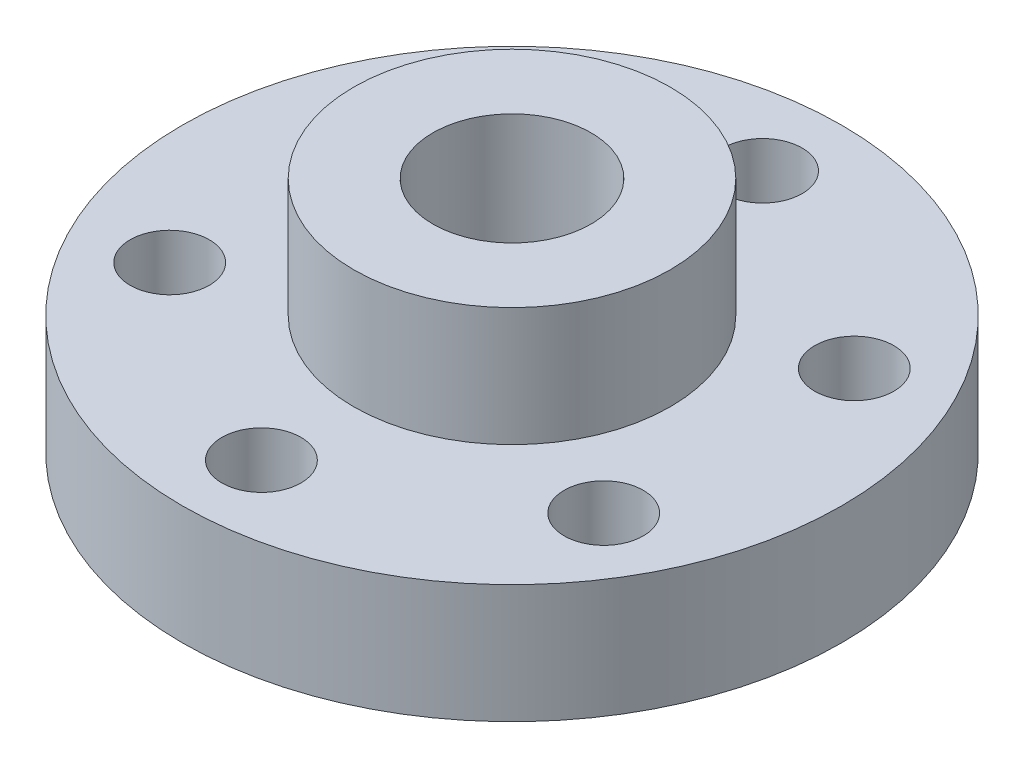
ISO-10303-21;
HEADER;
FILE_DESCRIPTION(('STEP AP214'),'2;1');
FILE_NAME('part.step','',(''),(''),'','','');
FILE_SCHEMA(('AUTOMOTIVE_DESIGN { 1 0 10303 214 1 1 1 1 }'));
ENDSEC;
DATA;
#1=APPLICATION_CONTEXT('core data for automotive mechanical design processes');
#2=APPLICATION_PROTOCOL_DEFINITION('international standard','automotive_design',2000,#1);
#3=PRODUCT_CONTEXT('',#1,'mechanical');
#4=PRODUCT('Part','Part','',(#3));
#5=PRODUCT_RELATED_PRODUCT_CATEGORY('part','',(#4));
#6=PRODUCT_DEFINITION_FORMATION('','',#4);
#7=PRODUCT_DEFINITION_CONTEXT('part definition',#1,'design');
#8=PRODUCT_DEFINITION('design','',#6,#7);
#9=PRODUCT_DEFINITION_SHAPE('','',#8);
#10=(LENGTH_UNIT() NAMED_UNIT(*) SI_UNIT(.MILLI.,.METRE.));
#11=(NAMED_UNIT(*) PLANE_ANGLE_UNIT() SI_UNIT($,.RADIAN.));
#12=(NAMED_UNIT(*) SI_UNIT($,.STERADIAN.) SOLID_ANGLE_UNIT());
#13=UNCERTAINTY_MEASURE_WITH_UNIT(LENGTH_MEASURE(1.E-05),#10,'distance_accuracy_value','');
#14=(GEOMETRIC_REPRESENTATION_CONTEXT(3) GLOBAL_UNCERTAINTY_ASSIGNED_CONTEXT((#13)) GLOBAL_UNIT_ASSIGNED_CONTEXT((#10,
#11,#12)) REPRESENTATION_CONTEXT('',''));
#15=CARTESIAN_POINT('',(0.,0.,0.));
#16=DIRECTION('',(0.,0.,1.));
#17=DIRECTION('',(1.,0.,0.));
#18=AXIS2_PLACEMENT_3D('',#15,#16,#17);
#19=CARTESIAN_POINT('',(0.,4.5,0.));
#20=DIRECTION('',(0.,1.,0.));
#21=DIRECTION('',(0.,0.,1.));
#22=AXIS2_PLACEMENT_3D('',#19,#20,#21);
#23=PLANE('',#22);
#24=CARTESIAN_POINT('',(0.,4.5,0.));
#25=DIRECTION('',(0.,1.,0.));
#26=DIRECTION('',(0.,0.,1.));
#27=AXIS2_PLACEMENT_3D('',#24,#25,#26);
#28=CIRCLE('',#27,12.5);
#29=CARTESIAN_POINT('',(0.,4.5,12.5));
#30=VERTEX_POINT('',#29);
#31=EDGE_CURVE('E11',#30,#30,#28,.T.);
#32=ORIENTED_EDGE('',*,*,#31,.T.);
#33=EDGE_LOOP('',(#32));
#34=FACE_BOUND('',#33,.T.);
#35=CARTESIAN_POINT('',(0.,4.5,-9.5));
#36=DIRECTION('',(0.,1.,0.));
#37=DIRECTION('',(0.,0.,1.));
#38=AXIS2_PLACEMENT_3D('',#35,#36,#37);
#39=CIRCLE('',#38,1.5);
#40=CARTESIAN_POINT('',(0.,4.5,-8.));
#41=VERTEX_POINT('',#40);
#42=EDGE_CURVE('E54',#41,#41,#39,.T.);
#43=ORIENTED_EDGE('',*,*,#42,.F.);
#44=EDGE_LOOP('',(#43));
#45=FACE_BOUND('',#44,.T.);
#46=CARTESIAN_POINT('',(8.22724133595243,4.5,-4.75000000000047));
#47=DIRECTION('',(0.,1.,0.));
#48=DIRECTION('',(0.,0.,1.));
#49=AXIS2_PLACEMENT_3D('',#46,#47,#48);
#50=CIRCLE('',#49,1.50000000000014);
#51=CARTESIAN_POINT('',(8.22724133595243,4.5,-3.25000000000032));
#52=VERTEX_POINT('',#51);
#53=EDGE_CURVE('E60',#52,#52,#50,.T.);
#54=ORIENTED_EDGE('',*,*,#53,.F.);
#55=EDGE_LOOP('',(#54));
#56=FACE_BOUND('',#55,.T.);
#57=CARTESIAN_POINT('',(8.22724133595298,4.5,4.74999999999953));
#58=DIRECTION('',(0.,1.,0.));
#59=DIRECTION('',(0.,0.,1.));
#60=AXIS2_PLACEMENT_3D('',#57,#58,#59);
#61=CIRCLE('',#60,1.50000000000068);
#62=CARTESIAN_POINT('',(8.22724133595298,4.5,6.25000000000021));
#63=VERTEX_POINT('',#62);
#64=EDGE_CURVE('E115',#63,#63,#61,.T.);
#65=ORIENTED_EDGE('',*,*,#64,.F.);
#66=EDGE_LOOP('',(#65));
#67=FACE_BOUND('',#66,.T.);
#68=CARTESIAN_POINT('',(1.07769812943697E-12,4.5,9.5));
#69=DIRECTION('',(0.,1.,0.));
#70=DIRECTION('',(0.,0.,1.));
#71=AXIS2_PLACEMENT_3D('',#68,#69,#70);
#72=CIRCLE('',#71,1.50000000000109);
#73=CARTESIAN_POINT('',(1.07769812943697E-12,4.5,11.0000000000011));
#74=VERTEX_POINT('',#73);
#75=EDGE_CURVE('E106',#74,#74,#72,.T.);
#76=ORIENTED_EDGE('',*,*,#75,.F.);
#77=EDGE_LOOP('',(#76));
#78=FACE_BOUND('',#77,.T.);
#79=CARTESIAN_POINT('',(-8.22724133595136,4.5,4.75000000000047));
#80=DIRECTION('',(0.,1.,0.));
#81=DIRECTION('',(0.,0.,1.));
#82=AXIS2_PLACEMENT_3D('',#79,#80,#81);
#83=CIRCLE('',#82,1.50000000000099);
#84=CARTESIAN_POINT('',(-8.22724133595136,4.5,6.25000000000146));
#85=VERTEX_POINT('',#84);
#86=EDGE_CURVE('E100',#85,#85,#83,.T.);
#87=ORIENTED_EDGE('',*,*,#86,.F.);
#88=EDGE_LOOP('',(#87));
#89=FACE_BOUND('',#88,.T.);
#90=CARTESIAN_POINT('',(-8.2272413359519,4.5,-4.74999999999953));
#91=DIRECTION('',(0.,1.,0.));
#92=DIRECTION('',(0.,0.,1.));
#93=AXIS2_PLACEMENT_3D('',#90,#91,#92);
#94=CIRCLE('',#93,1.50000000000051);
#95=CARTESIAN_POINT('',(-8.2272413359519,4.5,-3.24999999999902));
#96=VERTEX_POINT('',#95);
#97=EDGE_CURVE('E95',#96,#96,#94,.T.);
#98=ORIENTED_EDGE('',*,*,#97,.F.);
#99=EDGE_LOOP('',(#98));
#100=FACE_BOUND('',#99,.T.);
#101=CARTESIAN_POINT('',(0.,4.5,0.));
#102=DIRECTION('',(0.,1.,0.));
#103=DIRECTION('',(0.,0.,1.));
#104=AXIS2_PLACEMENT_3D('',#101,#102,#103);
#105=CIRCLE('',#104,6.);
#106=CARTESIAN_POINT('',(0.,4.5,6.));
#107=VERTEX_POINT('',#106);
#108=EDGE_CURVE('E109',#107,#107,#105,.T.);
#109=ORIENTED_EDGE('',*,*,#108,.F.);
#110=EDGE_LOOP('',(#109));
#111=FACE_BOUND('',#110,.T.);
#112=ADVANCED_FACE('F45',(#34,#45,#56,#67,#78,#89,#100,#111),#23,.T.);
#113=CARTESIAN_POINT('',(0.,4.5,-9.5));
#114=DIRECTION('',(0.,-1.,0.));
#115=DIRECTION('',(0.,0.,-1.));
#116=AXIS2_PLACEMENT_3D('',#113,#114,#115);
#117=CYLINDRICAL_SURFACE('',#116,1.5);
#118=ORIENTED_EDGE('',*,*,#42,.T.);
#119=EDGE_LOOP('',(#118));
#120=FACE_BOUND('',#119,.T.);
#121=CARTESIAN_POINT('',(0.,0.,-9.5));
#122=DIRECTION('',(0.,1.,0.));
#123=DIRECTION('',(0.,0.,1.));
#124=AXIS2_PLACEMENT_3D('',#121,#122,#123);
#125=CIRCLE('',#124,1.5);
#126=CARTESIAN_POINT('',(0.,0.,-8.));
#127=VERTEX_POINT('',#126);
#128=EDGE_CURVE('E88',#127,#127,#125,.T.);
#129=ORIENTED_EDGE('',*,*,#128,.F.);
#130=EDGE_LOOP('',(#129));
#131=FACE_BOUND('',#130,.T.);
#132=ADVANCED_FACE('F127',(#120,#131),#117,.F.);
#133=CARTESIAN_POINT('',(8.22724133595243,4.5,-4.75000000000047));
#134=DIRECTION('',(0.,-1.,0.));
#135=DIRECTION('',(0.,0.,-1.));
#136=AXIS2_PLACEMENT_3D('',#133,#134,#135);
#137=CYLINDRICAL_SURFACE('',#136,1.50000000000014);
#138=ORIENTED_EDGE('',*,*,#53,.T.);
#139=EDGE_LOOP('',(#138));
#140=FACE_BOUND('',#139,.T.);
#141=CARTESIAN_POINT('',(8.22724133595243,0.,-4.75000000000047));
#142=DIRECTION('',(0.,1.,0.));
#143=DIRECTION('',(0.,0.,1.));
#144=AXIS2_PLACEMENT_3D('',#141,#142,#143);
#145=CIRCLE('',#144,1.50000000000014);
#146=CARTESIAN_POINT('',(8.22724133595243,0.,-3.25000000000032));
#147=VERTEX_POINT('',#146);
#148=EDGE_CURVE('E85',#147,#147,#145,.T.);
#149=ORIENTED_EDGE('',*,*,#148,.F.);
#150=EDGE_LOOP('',(#149));
#151=FACE_BOUND('',#150,.T.);
#152=ADVANCED_FACE('F122',(#140,#151),#137,.F.);
#153=CARTESIAN_POINT('',(8.22724133595298,4.5,4.74999999999953));
#154=DIRECTION('',(0.,-1.,0.));
#155=DIRECTION('',(0.,0.,-1.));
#156=AXIS2_PLACEMENT_3D('',#153,#154,#155);
#157=CYLINDRICAL_SURFACE('',#156,1.50000000000068);
#158=ORIENTED_EDGE('',*,*,#64,.T.);
#159=EDGE_LOOP('',(#158));
#160=FACE_BOUND('',#159,.T.);
#161=CARTESIAN_POINT('',(8.22724133595298,0.,4.74999999999953));
#162=DIRECTION('',(0.,1.,0.));
#163=DIRECTION('',(0.,0.,1.));
#164=AXIS2_PLACEMENT_3D('',#161,#162,#163);
#165=CIRCLE('',#164,1.50000000000068);
#166=CARTESIAN_POINT('',(8.22724133595298,0.,6.25000000000021));
#167=VERTEX_POINT('',#166);
#168=EDGE_CURVE('E81',#167,#167,#165,.T.);
#169=ORIENTED_EDGE('',*,*,#168,.F.);
#170=EDGE_LOOP('',(#169));
#171=FACE_BOUND('',#170,.T.);
#172=ADVANCED_FACE('F173',(#160,#171),#157,.F.);
#173=CARTESIAN_POINT('',(1.07769812943697E-12,4.5,9.5));
#174=DIRECTION('',(0.,-1.,0.));
#175=DIRECTION('',(0.,0.,-1.));
#176=AXIS2_PLACEMENT_3D('',#173,#174,#175);
#177=CYLINDRICAL_SURFACE('',#176,1.50000000000109);
#178=ORIENTED_EDGE('',*,*,#75,.T.);
#179=EDGE_LOOP('',(#178));
#180=FACE_BOUND('',#179,.T.);
#181=CARTESIAN_POINT('',(1.07769812943697E-12,0.,9.5));
#182=DIRECTION('',(0.,1.,0.));
#183=DIRECTION('',(0.,0.,1.));
#184=AXIS2_PLACEMENT_3D('',#181,#182,#183);
#185=CIRCLE('',#184,1.50000000000109);
#186=CARTESIAN_POINT('',(1.07769812943697E-12,0.,11.0000000000011));
#187=VERTEX_POINT('',#186);
#188=EDGE_CURVE('E77',#187,#187,#185,.T.);
#189=ORIENTED_EDGE('',*,*,#188,.F.);
#190=EDGE_LOOP('',(#189));
#191=FACE_BOUND('',#190,.T.);
#192=ADVANCED_FACE('F176',(#180,#191),#177,.F.);
#193=CARTESIAN_POINT('',(-8.22724133595136,4.5,4.75000000000047));
#194=DIRECTION('',(0.,-1.,0.));
#195=DIRECTION('',(0.,0.,-1.));
#196=AXIS2_PLACEMENT_3D('',#193,#194,#195);
#197=CYLINDRICAL_SURFACE('',#196,1.50000000000099);
#198=ORIENTED_EDGE('',*,*,#86,.T.);
#199=EDGE_LOOP('',(#198));
#200=FACE_BOUND('',#199,.T.);
#201=CARTESIAN_POINT('',(-8.22724133595136,0.,4.75000000000047));
#202=DIRECTION('',(0.,1.,0.));
#203=DIRECTION('',(0.,0.,1.));
#204=AXIS2_PLACEMENT_3D('',#201,#202,#203);
#205=CIRCLE('',#204,1.50000000000099);
#206=CARTESIAN_POINT('',(-8.22724133595136,0.,6.25000000000146));
#207=VERTEX_POINT('',#206);
#208=EDGE_CURVE('E73',#207,#207,#205,.T.);
#209=ORIENTED_EDGE('',*,*,#208,.F.);
#210=EDGE_LOOP('',(#209));
#211=FACE_BOUND('',#210,.T.);
#212=ADVANCED_FACE('F180',(#200,#211),#197,.F.);
#213=CARTESIAN_POINT('',(-8.2272413359519,4.5,-4.74999999999953));
#214=DIRECTION('',(0.,-1.,0.));
#215=DIRECTION('',(0.,0.,-1.));
#216=AXIS2_PLACEMENT_3D('',#213,#214,#215);
#217=CYLINDRICAL_SURFACE('',#216,1.50000000000051);
#218=ORIENTED_EDGE('',*,*,#97,.T.);
#219=EDGE_LOOP('',(#218));
#220=FACE_BOUND('',#219,.T.);
#221=CARTESIAN_POINT('',(-8.2272413359519,0.,-4.74999999999953));
#222=DIRECTION('',(0.,1.,0.));
#223=DIRECTION('',(0.,0.,1.));
#224=AXIS2_PLACEMENT_3D('',#221,#222,#223);
#225=CIRCLE('',#224,1.50000000000051);
#226=CARTESIAN_POINT('',(-8.2272413359519,0.,-3.24999999999902));
#227=VERTEX_POINT('',#226);
#228=EDGE_CURVE('E68',#227,#227,#225,.T.);
#229=ORIENTED_EDGE('',*,*,#228,.F.);
#230=EDGE_LOOP('',(#229));
#231=FACE_BOUND('',#230,.T.);
#232=ADVANCED_FACE('F183',(#220,#231),#217,.F.);
#233=CARTESIAN_POINT('',(0.,4.5,0.));
#234=DIRECTION('',(0.,-1.,0.));
#235=DIRECTION('',(0.,0.,-1.));
#236=AXIS2_PLACEMENT_3D('',#233,#234,#235);
#237=CYLINDRICAL_SURFACE('',#236,3.);
#238=CARTESIAN_POINT('',(0.,0.,0.));
#239=DIRECTION('',(0.,1.,0.));
#240=DIRECTION('',(0.,0.,1.));
#241=AXIS2_PLACEMENT_3D('',#238,#239,#240);
#242=CIRCLE('',#241,3.);
#243=CARTESIAN_POINT('',(0.,0.,3.));
#244=VERTEX_POINT('',#243);
#245=EDGE_CURVE('E64',#244,#244,#242,.T.);
#246=ORIENTED_EDGE('',*,*,#245,.F.);
#247=EDGE_LOOP('',(#246));
#248=FACE_BOUND('',#247,.T.);
#249=CARTESIAN_POINT('',(0.,9.,0.));
#250=DIRECTION('',(0.,1.,0.));
#251=DIRECTION('',(0.,0.,1.));
#252=AXIS2_PLACEMENT_3D('',#249,#250,#251);
#253=CIRCLE('',#252,3.);
#254=CARTESIAN_POINT('',(0.,9.,3.));
#255=VERTEX_POINT('',#254);
#256=EDGE_CURVE('E140',#255,#255,#253,.T.);
#257=ORIENTED_EDGE('',*,*,#256,.T.);
#258=EDGE_LOOP('',(#257));
#259=FACE_BOUND('',#258,.T.);
#260=ADVANCED_FACE('F47',(#248,#259),#237,.F.);
#261=CARTESIAN_POINT('',(0.,4.5,0.));
#262=DIRECTION('',(0.,-1.,0.));
#263=DIRECTION('',(0.,0.,-1.));
#264=AXIS2_PLACEMENT_3D('',#261,#262,#263);
#265=CYLINDRICAL_SURFACE('',#264,12.5);
#266=ORIENTED_EDGE('',*,*,#31,.F.);
#267=EDGE_LOOP('',(#266));
#268=FACE_BOUND('',#267,.T.);
#269=CARTESIAN_POINT('',(0.,0.,0.));
#270=DIRECTION('',(0.,1.,0.));
#271=DIRECTION('',(0.,0.,1.));
#272=AXIS2_PLACEMENT_3D('',#269,#270,#271);
#273=CIRCLE('',#272,12.5);
#274=CARTESIAN_POINT('',(0.,0.,12.5));
#275=VERTEX_POINT('',#274);
#276=EDGE_CURVE('E49',#275,#275,#273,.T.);
#277=ORIENTED_EDGE('',*,*,#276,.T.);
#278=EDGE_LOOP('',(#277));
#279=FACE_BOUND('',#278,.T.);
#280=ADVANCED_FACE('F161',(#268,#279),#265,.T.);
#281=CARTESIAN_POINT('',(0.,0.,0.));
#282=DIRECTION('',(0.,1.,0.));
#283=DIRECTION('',(0.,0.,1.));
#284=AXIS2_PLACEMENT_3D('',#281,#282,#283);
#285=PLANE('',#284);
#286=ORIENTED_EDGE('',*,*,#245,.T.);
#287=EDGE_LOOP('',(#286));
#288=FACE_BOUND('',#287,.T.);
#289=ORIENTED_EDGE('',*,*,#228,.T.);
#290=EDGE_LOOP('',(#289));
#291=FACE_BOUND('',#290,.T.);
#292=ORIENTED_EDGE('',*,*,#208,.T.);
#293=EDGE_LOOP('',(#292));
#294=FACE_BOUND('',#293,.T.);
#295=ORIENTED_EDGE('',*,*,#188,.T.);
#296=EDGE_LOOP('',(#295));
#297=FACE_BOUND('',#296,.T.);
#298=ORIENTED_EDGE('',*,*,#168,.T.);
#299=EDGE_LOOP('',(#298));
#300=FACE_BOUND('',#299,.T.);
#301=ORIENTED_EDGE('',*,*,#148,.T.);
#302=EDGE_LOOP('',(#301));
#303=FACE_BOUND('',#302,.T.);
#304=ORIENTED_EDGE('',*,*,#128,.T.);
#305=EDGE_LOOP('',(#304));
#306=FACE_BOUND('',#305,.T.);
#307=ORIENTED_EDGE('',*,*,#276,.F.);
#308=EDGE_LOOP('',(#307));
#309=FACE_BOUND('',#308,.T.);
#310=ADVANCED_FACE('F152',(#288,#291,#294,#297,#300,#303,#306,#309),#285,.F.);
#311=CARTESIAN_POINT('',(0.,9.,0.));
#312=DIRECTION('',(0.,1.,0.));
#313=DIRECTION('',(0.,0.,1.));
#314=AXIS2_PLACEMENT_3D('',#311,#312,#313);
#315=PLANE('',#314);
#316=CARTESIAN_POINT('',(0.,9.,0.));
#317=DIRECTION('',(0.,1.,0.));
#318=DIRECTION('',(0.,0.,1.));
#319=AXIS2_PLACEMENT_3D('',#316,#317,#318);
#320=CIRCLE('',#319,6.);
#321=CARTESIAN_POINT('',(0.,9.,6.));
#322=VERTEX_POINT('',#321);
#323=EDGE_CURVE('E69',#322,#322,#320,.T.);
#324=ORIENTED_EDGE('',*,*,#323,.T.);
#325=EDGE_LOOP('',(#324));
#326=FACE_BOUND('',#325,.T.);
#327=ORIENTED_EDGE('',*,*,#256,.F.);
#328=EDGE_LOOP('',(#327));
#329=FACE_BOUND('',#328,.T.);
#330=ADVANCED_FACE('F149',(#326,#329),#315,.T.);
#331=CARTESIAN_POINT('',(0.,9.,0.));
#332=DIRECTION('',(0.,-1.,0.));
#333=DIRECTION('',(0.,0.,-1.));
#334=AXIS2_PLACEMENT_3D('',#331,#332,#333);
#335=CYLINDRICAL_SURFACE('',#334,6.);
#336=ORIENTED_EDGE('',*,*,#323,.F.);
#337=EDGE_LOOP('',(#336));
#338=FACE_BOUND('',#337,.T.);
#339=ORIENTED_EDGE('',*,*,#108,.T.);
#340=EDGE_LOOP('',(#339));
#341=FACE_BOUND('',#340,.T.);
#342=ADVANCED_FACE('F151',(#338,#341),#335,.T.);
#343=CLOSED_SHELL('',(#112,#132,#152,#172,#192,#212,#232,#260,#280,#310,#330,#342));
#344=MANIFOLD_SOLID_BREP('B2',#343);
#345=ADVANCED_BREP_SHAPE_REPRESENTATION('',(#18,#344),#14);
#346=SHAPE_DEFINITION_REPRESENTATION(#9,#345);
ENDSEC;
END-ISO-10303-21;
